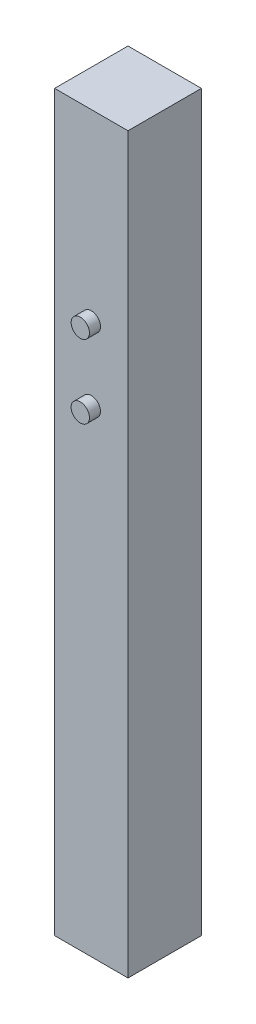
ISO-10303-21;
HEADER;
FILE_DESCRIPTION(('STEP AP214'),'2;1');
FILE_NAME('part.step','',(''),(''),'','','');
FILE_SCHEMA(('AUTOMOTIVE_DESIGN { 1 0 10303 214 1 1 1 1 }'));
ENDSEC;
DATA;
#1=APPLICATION_CONTEXT('core data for automotive mechanical design processes');
#2=APPLICATION_PROTOCOL_DEFINITION('international standard','automotive_design',2000,#1);
#3=PRODUCT_CONTEXT('',#1,'mechanical');
#4=PRODUCT('Part','Part','',(#3));
#5=PRODUCT_RELATED_PRODUCT_CATEGORY('part','',(#4));
#6=PRODUCT_DEFINITION_FORMATION('','',#4);
#7=PRODUCT_DEFINITION_CONTEXT('part definition',#1,'design');
#8=PRODUCT_DEFINITION('design','',#6,#7);
#9=PRODUCT_DEFINITION_SHAPE('','',#8);
#10=(LENGTH_UNIT() NAMED_UNIT(*) SI_UNIT(.MILLI.,.METRE.));
#11=(NAMED_UNIT(*) PLANE_ANGLE_UNIT() SI_UNIT($,.RADIAN.));
#12=(NAMED_UNIT(*) SI_UNIT($,.STERADIAN.) SOLID_ANGLE_UNIT());
#13=UNCERTAINTY_MEASURE_WITH_UNIT(LENGTH_MEASURE(1.E-05),#10,'distance_accuracy_value','');
#14=(GEOMETRIC_REPRESENTATION_CONTEXT(3) GLOBAL_UNCERTAINTY_ASSIGNED_CONTEXT((#13)) GLOBAL_UNIT_ASSIGNED_CONTEXT((#10,
#11,#12)) REPRESENTATION_CONTEXT('',''));
#15=CARTESIAN_POINT('',(0.,0.,0.));
#16=DIRECTION('',(0.,0.,1.));
#17=DIRECTION('',(1.,0.,0.));
#18=AXIS2_PLACEMENT_3D('',#15,#16,#17);
#19=CARTESIAN_POINT('',(0.,200.,20.));
#20=DIRECTION('',(1.,0.,0.));
#21=DIRECTION('',(0.,0.,-1.));
#22=AXIS2_PLACEMENT_3D('',#19,#20,#21);
#23=PLANE('',#22);
#24=DIRECTION('',(0.,0.,1.));
#25=VECTOR('',#24,1.);
#26=CARTESIAN_POINT('',(0.,0.,20.));
#27=LINE('',#26,#25);
#28=CARTESIAN_POINT('',(0.,0.,0.));
#29=VERTEX_POINT('',#28);
#30=CARTESIAN_POINT('',(0.,0.,20.));
#31=VERTEX_POINT('',#30);
#32=EDGE_CURVE('E104',#29,#31,#27,.T.);
#33=ORIENTED_EDGE('',*,*,#32,.T.);
#34=DIRECTION('',(0.,-1.,0.));
#35=VECTOR('',#34,1.);
#36=CARTESIAN_POINT('',(0.,200.,20.));
#37=LINE('',#36,#35);
#38=CARTESIAN_POINT('',(0.,200.,20.));
#39=VERTEX_POINT('',#38);
#40=EDGE_CURVE('E95',#39,#31,#37,.T.);
#41=ORIENTED_EDGE('',*,*,#40,.F.);
#42=DIRECTION('',(0.,0.,1.));
#43=VECTOR('',#42,1.);
#44=CARTESIAN_POINT('',(0.,200.,20.));
#45=LINE('',#44,#43);
#46=CARTESIAN_POINT('',(0.,200.,0.));
#47=VERTEX_POINT('',#46);
#48=EDGE_CURVE('E89',#47,#39,#45,.T.);
#49=ORIENTED_EDGE('',*,*,#48,.F.);
#50=DIRECTION('',(0.,-1.,0.));
#51=VECTOR('',#50,1.);
#52=CARTESIAN_POINT('',(0.,200.,0.));
#53=LINE('',#52,#51);
#54=EDGE_CURVE('E100',#47,#29,#53,.T.);
#55=ORIENTED_EDGE('',*,*,#54,.T.);
#56=EDGE_LOOP('',(#33,#41,#49,#55));
#57=FACE_BOUND('',#56,.T.);
#58=ADVANCED_FACE('F37',(#57),#23,.F.);
#59=CARTESIAN_POINT('',(20.,200.,20.));
#60=DIRECTION('',(0.,0.,-1.));
#61=DIRECTION('',(-1.,0.,0.));
#62=AXIS2_PLACEMENT_3D('',#59,#60,#61);
#63=PLANE('',#62);
#64=CARTESIAN_POINT('',(10.,130.,20.));
#65=DIRECTION('',(0.,0.,-1.));
#66=DIRECTION('',(-1.,0.,0.));
#67=AXIS2_PLACEMENT_3D('',#64,#65,#66);
#68=CIRCLE('',#67,2.5);
#69=CARTESIAN_POINT('',(7.50000000000001,130.,20.));
#70=VERTEX_POINT('',#69);
#71=EDGE_CURVE('E11',#70,#70,#68,.F.);
#72=ORIENTED_EDGE('',*,*,#71,.F.);
#73=EDGE_LOOP('',(#72));
#74=FACE_BOUND('',#73,.T.);
#75=CARTESIAN_POINT('',(10.,150.,20.));
#76=DIRECTION('',(0.,0.,-1.));
#77=DIRECTION('',(-1.,0.,0.));
#78=AXIS2_PLACEMENT_3D('',#75,#76,#77);
#79=CIRCLE('',#78,2.5);
#80=CARTESIAN_POINT('',(7.50000000000001,150.,20.));
#81=VERTEX_POINT('',#80);
#82=EDGE_CURVE('E45',#81,#81,#79,.F.);
#83=ORIENTED_EDGE('',*,*,#82,.F.);
#84=EDGE_LOOP('',(#83));
#85=FACE_BOUND('',#84,.T.);
#86=DIRECTION('',(1.,0.,0.));
#87=VECTOR('',#86,1.);
#88=CARTESIAN_POINT('',(20.,0.,20.));
#89=LINE('',#88,#87);
#90=CARTESIAN_POINT('',(20.,0.,20.));
#91=VERTEX_POINT('',#90);
#92=EDGE_CURVE('E94',#31,#91,#89,.T.);
#93=ORIENTED_EDGE('',*,*,#92,.T.);
#94=DIRECTION('',(0.,-1.,0.));
#95=VECTOR('',#94,1.);
#96=CARTESIAN_POINT('',(20.,200.,20.));
#97=LINE('',#96,#95);
#98=CARTESIAN_POINT('',(20.,200.,20.));
#99=VERTEX_POINT('',#98);
#100=EDGE_CURVE('E92',#99,#91,#97,.T.);
#101=ORIENTED_EDGE('',*,*,#100,.F.);
#102=DIRECTION('',(1.,0.,0.));
#103=VECTOR('',#102,1.);
#104=CARTESIAN_POINT('',(20.,200.,20.));
#105=LINE('',#104,#103);
#106=EDGE_CURVE('E84',#39,#99,#105,.T.);
#107=ORIENTED_EDGE('',*,*,#106,.F.);
#108=ORIENTED_EDGE('',*,*,#40,.T.);
#109=EDGE_LOOP('',(#93,#101,#107,#108));
#110=FACE_BOUND('',#109,.T.);
#111=ADVANCED_FACE('F93',(#74,#85,#110),#63,.F.);
#112=CARTESIAN_POINT('',(20.,200.,0.));
#113=DIRECTION('',(-1.,0.,0.));
#114=DIRECTION('',(0.,0.,1.));
#115=AXIS2_PLACEMENT_3D('',#112,#113,#114);
#116=PLANE('',#115);
#117=DIRECTION('',(0.,0.,-1.));
#118=VECTOR('',#117,1.);
#119=CARTESIAN_POINT('',(20.,0.,0.));
#120=LINE('',#119,#118);
#121=CARTESIAN_POINT('',(20.,0.,0.));
#122=VERTEX_POINT('',#121);
#123=EDGE_CURVE('E70',#91,#122,#120,.T.);
#124=ORIENTED_EDGE('',*,*,#123,.T.);
#125=DIRECTION('',(0.,-1.,0.));
#126=VECTOR('',#125,1.);
#127=CARTESIAN_POINT('',(20.,200.,0.));
#128=LINE('',#127,#126);
#129=CARTESIAN_POINT('',(20.,200.,0.));
#130=VERTEX_POINT('',#129);
#131=EDGE_CURVE('E96',#130,#122,#128,.T.);
#132=ORIENTED_EDGE('',*,*,#131,.F.);
#133=DIRECTION('',(0.,0.,-1.));
#134=VECTOR('',#133,1.);
#135=CARTESIAN_POINT('',(20.,200.,0.));
#136=LINE('',#135,#134);
#137=EDGE_CURVE('E87',#99,#130,#136,.T.);
#138=ORIENTED_EDGE('',*,*,#137,.F.);
#139=ORIENTED_EDGE('',*,*,#100,.T.);
#140=EDGE_LOOP('',(#124,#132,#138,#139));
#141=FACE_BOUND('',#140,.T.);
#142=ADVANCED_FACE('F98',(#141),#116,.F.);
#143=CARTESIAN_POINT('',(0.,200.,0.));
#144=DIRECTION('',(0.,0.,1.));
#145=DIRECTION('',(1.,0.,0.));
#146=AXIS2_PLACEMENT_3D('',#143,#144,#145);
#147=PLANE('',#146);
#148=DIRECTION('',(-1.,0.,0.));
#149=VECTOR('',#148,1.);
#150=CARTESIAN_POINT('',(0.,0.,0.));
#151=LINE('',#150,#149);
#152=EDGE_CURVE('E76',#122,#29,#151,.T.);
#153=ORIENTED_EDGE('',*,*,#152,.T.);
#154=ORIENTED_EDGE('',*,*,#54,.F.);
#155=DIRECTION('',(-1.,0.,0.));
#156=VECTOR('',#155,1.);
#157=CARTESIAN_POINT('',(0.,200.,0.));
#158=LINE('',#157,#156);
#159=EDGE_CURVE('E53',#130,#47,#158,.T.);
#160=ORIENTED_EDGE('',*,*,#159,.F.);
#161=ORIENTED_EDGE('',*,*,#131,.T.);
#162=EDGE_LOOP('',(#153,#154,#160,#161));
#163=FACE_BOUND('',#162,.T.);
#164=ADVANCED_FACE('F124',(#163),#147,.F.);
#165=CARTESIAN_POINT('',(0.,200.,0.));
#166=DIRECTION('',(0.,-1.,0.));
#167=DIRECTION('',(0.,0.,-1.));
#168=AXIS2_PLACEMENT_3D('',#165,#166,#167);
#169=PLANE('',#168);
#170=ORIENTED_EDGE('',*,*,#48,.T.);
#171=ORIENTED_EDGE('',*,*,#106,.T.);
#172=ORIENTED_EDGE('',*,*,#137,.T.);
#173=ORIENTED_EDGE('',*,*,#159,.T.);
#174=EDGE_LOOP('',(#170,#171,#172,#173));
#175=FACE_BOUND('',#174,.T.);
#176=ADVANCED_FACE('F85',(#175),#169,.F.);
#177=CARTESIAN_POINT('',(0.,0.,0.));
#178=DIRECTION('',(0.,-1.,0.));
#179=DIRECTION('',(0.,0.,-1.));
#180=AXIS2_PLACEMENT_3D('',#177,#178,#179);
#181=PLANE('',#180);
#182=ORIENTED_EDGE('',*,*,#32,.F.);
#183=ORIENTED_EDGE('',*,*,#152,.F.);
#184=ORIENTED_EDGE('',*,*,#123,.F.);
#185=ORIENTED_EDGE('',*,*,#92,.F.);
#186=EDGE_LOOP('',(#182,#183,#184,#185));
#187=FACE_BOUND('',#186,.T.);
#188=ADVANCED_FACE('F131',(#187),#181,.T.);
#189=CARTESIAN_POINT('',(10.,150.,23.));
#190=DIRECTION('',(0.,0.,-1.));
#191=DIRECTION('',(-1.,0.,0.));
#192=AXIS2_PLACEMENT_3D('',#189,#190,#191);
#193=CYLINDRICAL_SURFACE('',#192,2.5);
#194=CARTESIAN_POINT('',(10.,150.,23.));
#195=DIRECTION('',(0.,0.,1.));
#196=DIRECTION('',(1.,0.,0.));
#197=AXIS2_PLACEMENT_3D('',#194,#195,#196);
#198=CIRCLE('',#197,2.5);
#199=CARTESIAN_POINT('',(12.5,150.,23.));
#200=VERTEX_POINT('',#199);
#201=EDGE_CURVE('E107',#200,#200,#198,.T.);
#202=ORIENTED_EDGE('',*,*,#201,.F.);
#203=EDGE_LOOP('',(#202));
#204=FACE_BOUND('',#203,.T.);
#205=ORIENTED_EDGE('',*,*,#82,.T.);
#206=EDGE_LOOP('',(#205));
#207=FACE_BOUND('',#206,.T.);
#208=ADVANCED_FACE('F116',(#204,#207),#193,.T.);
#209=CARTESIAN_POINT('',(10.,150.,23.));
#210=DIRECTION('',(0.,0.,1.));
#211=DIRECTION('',(1.,0.,0.));
#212=AXIS2_PLACEMENT_3D('',#209,#210,#211);
#213=PLANE('',#212);
#214=ORIENTED_EDGE('',*,*,#201,.T.);
#215=EDGE_LOOP('',(#214));
#216=FACE_BOUND('',#215,.T.);
#217=ADVANCED_FACE('F139',(#216),#213,.T.);
#218=CARTESIAN_POINT('',(10.,130.,23.));
#219=DIRECTION('',(0.,0.,-1.));
#220=DIRECTION('',(-1.,0.,0.));
#221=AXIS2_PLACEMENT_3D('',#218,#219,#220);
#222=CYLINDRICAL_SURFACE('',#221,2.5);
#223=CARTESIAN_POINT('',(10.,130.,23.));
#224=DIRECTION('',(0.,0.,1.));
#225=DIRECTION('',(1.,0.,0.));
#226=AXIS2_PLACEMENT_3D('',#223,#224,#225);
#227=CIRCLE('',#226,2.5);
#228=CARTESIAN_POINT('',(12.5,130.,23.));
#229=VERTEX_POINT('',#228);
#230=EDGE_CURVE('E156',#229,#229,#227,.T.);
#231=ORIENTED_EDGE('',*,*,#230,.F.);
#232=EDGE_LOOP('',(#231));
#233=FACE_BOUND('',#232,.T.);
#234=ORIENTED_EDGE('',*,*,#71,.T.);
#235=EDGE_LOOP('',(#234));
#236=FACE_BOUND('',#235,.T.);
#237=ADVANCED_FACE('F143',(#233,#236),#222,.T.);
#238=CARTESIAN_POINT('',(10.,130.,23.));
#239=DIRECTION('',(0.,0.,1.));
#240=DIRECTION('',(1.,0.,0.));
#241=AXIS2_PLACEMENT_3D('',#238,#239,#240);
#242=PLANE('',#241);
#243=ORIENTED_EDGE('',*,*,#230,.T.);
#244=EDGE_LOOP('',(#243));
#245=FACE_BOUND('',#244,.T.);
#246=ADVANCED_FACE('F145',(#245),#242,.T.);
#247=CLOSED_SHELL('',(#58,#111,#142,#164,#176,#188,#208,#217,#237,#246));
#248=MANIFOLD_SOLID_BREP('B2',#247);
#249=ADVANCED_BREP_SHAPE_REPRESENTATION('',(#18,#248),#14);
#250=SHAPE_DEFINITION_REPRESENTATION(#9,#249);
ENDSEC;
END-ISO-10303-21;
